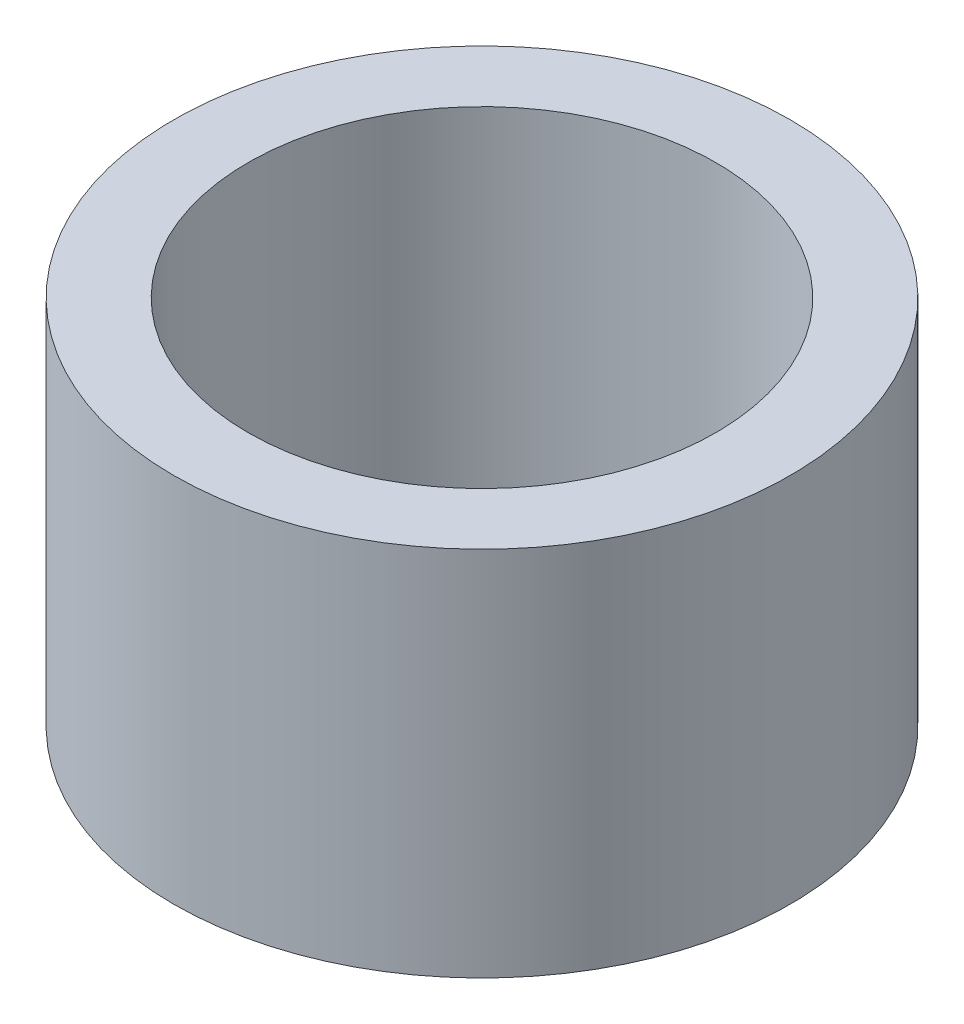
ISO-10303-21;
HEADER;
FILE_DESCRIPTION(('STEP AP214'),'2;1');
FILE_NAME('part.step','',(''),(''),'','','');
FILE_SCHEMA(('AUTOMOTIVE_DESIGN { 1 0 10303 214 1 1 1 1 }'));
ENDSEC;
DATA;
#1=APPLICATION_CONTEXT('core data for automotive mechanical design processes');
#2=APPLICATION_PROTOCOL_DEFINITION('international standard','automotive_design',2000,#1);
#3=PRODUCT_CONTEXT('',#1,'mechanical');
#4=PRODUCT('Part','Part','',(#3));
#5=PRODUCT_RELATED_PRODUCT_CATEGORY('part','',(#4));
#6=PRODUCT_DEFINITION_FORMATION('','',#4);
#7=PRODUCT_DEFINITION_CONTEXT('part definition',#1,'design');
#8=PRODUCT_DEFINITION('design','',#6,#7);
#9=PRODUCT_DEFINITION_SHAPE('','',#8);
#10=(LENGTH_UNIT() NAMED_UNIT(*) SI_UNIT(.MILLI.,.METRE.));
#11=(NAMED_UNIT(*) PLANE_ANGLE_UNIT() SI_UNIT($,.RADIAN.));
#12=(NAMED_UNIT(*) SI_UNIT($,.STERADIAN.) SOLID_ANGLE_UNIT());
#13=UNCERTAINTY_MEASURE_WITH_UNIT(LENGTH_MEASURE(1.E-05),#10,'distance_accuracy_value','');
#14=(GEOMETRIC_REPRESENTATION_CONTEXT(3) GLOBAL_UNCERTAINTY_ASSIGNED_CONTEXT((#13)) GLOBAL_UNIT_ASSIGNED_CONTEXT((#10,
#11,#12)) REPRESENTATION_CONTEXT('',''));
#15=CARTESIAN_POINT('',(0.,0.,0.));
#16=DIRECTION('',(0.,0.,1.));
#17=DIRECTION('',(1.,0.,0.));
#18=AXIS2_PLACEMENT_3D('',#15,#16,#17);
#19=CARTESIAN_POINT('',(0.,6.35,0.));
#20=DIRECTION('',(0.,1.,0.));
#21=DIRECTION('',(0.,0.,1.));
#22=AXIS2_PLACEMENT_3D('',#19,#20,#21);
#23=PLANE('',#22);
#24=CARTESIAN_POINT('',(0.,6.35,0.));
#25=DIRECTION('',(0.,1.,0.));
#26=DIRECTION('',(0.,0.,1.));
#27=AXIS2_PLACEMENT_3D('',#24,#25,#26);
#28=CIRCLE('',#27,5.27);
#29=CARTESIAN_POINT('',(0.,6.35,5.27));
#30=VERTEX_POINT('',#29);
#31=EDGE_CURVE('E10',#30,#30,#28,.T.);
#32=ORIENTED_EDGE('',*,*,#31,.T.);
#33=EDGE_LOOP('',(#32));
#34=FACE_BOUND('',#33,.T.);
#35=CARTESIAN_POINT('',(0.,6.35,0.));
#36=DIRECTION('',(0.,1.,0.));
#37=DIRECTION('',(0.,0.,1.));
#38=AXIS2_PLACEMENT_3D('',#35,#36,#37);
#39=CIRCLE('',#38,4.);
#40=CARTESIAN_POINT('',(0.,6.35,4.));
#41=VERTEX_POINT('',#40);
#42=EDGE_CURVE('E50',#41,#41,#39,.T.);
#43=ORIENTED_EDGE('',*,*,#42,.F.);
#44=EDGE_LOOP('',(#43));
#45=FACE_BOUND('',#44,.T.);
#46=ADVANCED_FACE('F39',(#34,#45),#23,.T.);
#47=CARTESIAN_POINT('',(0.,0.,0.));
#48=DIRECTION('',(0.,1.,0.));
#49=DIRECTION('',(0.,0.,1.));
#50=AXIS2_PLACEMENT_3D('',#47,#48,#49);
#51=PLANE('',#50);
#52=CARTESIAN_POINT('',(0.,0.,0.));
#53=DIRECTION('',(0.,1.,0.));
#54=DIRECTION('',(0.,0.,1.));
#55=AXIS2_PLACEMENT_3D('',#52,#53,#54);
#56=CIRCLE('',#55,5.27);
#57=CARTESIAN_POINT('',(0.,0.,5.27));
#58=VERTEX_POINT('',#57);
#59=EDGE_CURVE('E43',#58,#58,#56,.T.);
#60=ORIENTED_EDGE('',*,*,#59,.F.);
#61=EDGE_LOOP('',(#60));
#62=FACE_BOUND('',#61,.T.);
#63=CARTESIAN_POINT('',(0.,0.,0.));
#64=DIRECTION('',(0.,1.,0.));
#65=DIRECTION('',(0.,0.,1.));
#66=AXIS2_PLACEMENT_3D('',#63,#64,#65);
#67=CIRCLE('',#66,4.);
#68=CARTESIAN_POINT('',(0.,0.,4.));
#69=VERTEX_POINT('',#68);
#70=EDGE_CURVE('E52',#69,#69,#67,.T.);
#71=ORIENTED_EDGE('',*,*,#70,.T.);
#72=EDGE_LOOP('',(#71));
#73=FACE_BOUND('',#72,.T.);
#74=ADVANCED_FACE('F62',(#62,#73),#51,.F.);
#75=CARTESIAN_POINT('',(0.,6.35,0.));
#76=DIRECTION('',(0.,-1.,0.));
#77=DIRECTION('',(0.,0.,-1.));
#78=AXIS2_PLACEMENT_3D('',#75,#76,#77);
#79=CYLINDRICAL_SURFACE('',#78,5.27);
#80=ORIENTED_EDGE('',*,*,#31,.F.);
#81=EDGE_LOOP('',(#80));
#82=FACE_BOUND('',#81,.T.);
#83=ORIENTED_EDGE('',*,*,#59,.T.);
#84=EDGE_LOOP('',(#83));
#85=FACE_BOUND('',#84,.T.);
#86=ADVANCED_FACE('F41',(#82,#85),#79,.T.);
#87=CARTESIAN_POINT('',(0.,6.35,0.));
#88=DIRECTION('',(0.,-1.,0.));
#89=DIRECTION('',(0.,0.,-1.));
#90=AXIS2_PLACEMENT_3D('',#87,#88,#89);
#91=CYLINDRICAL_SURFACE('',#90,4.);
#92=ORIENTED_EDGE('',*,*,#42,.T.);
#93=EDGE_LOOP('',(#92));
#94=FACE_BOUND('',#93,.T.);
#95=ORIENTED_EDGE('',*,*,#70,.F.);
#96=EDGE_LOOP('',(#95));
#97=FACE_BOUND('',#96,.T.);
#98=ADVANCED_FACE('F58',(#94,#97),#91,.F.);
#99=CLOSED_SHELL('',(#46,#74,#86,#98));
#100=MANIFOLD_SOLID_BREP('B2',#99);
#101=ADVANCED_BREP_SHAPE_REPRESENTATION('',(#18,#100),#14);
#102=SHAPE_DEFINITION_REPRESENTATION(#9,#101);
ENDSEC;
END-ISO-10303-21;
